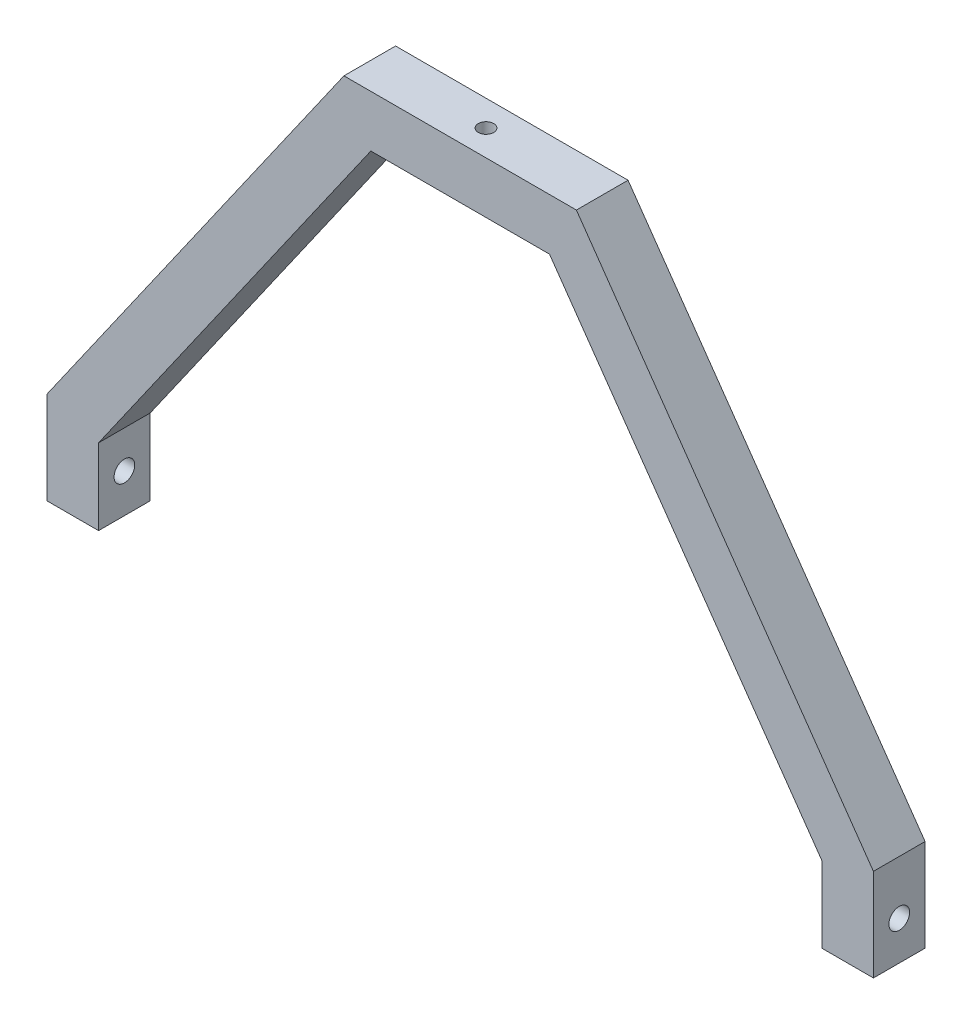
ISO-10303-21;
HEADER;
FILE_DESCRIPTION(('STEP AP214'),'2;1');
FILE_NAME('part.step','',(''),(''),'','','');
FILE_SCHEMA(('AUTOMOTIVE_DESIGN { 1 0 10303 214 1 1 1 1 }'));
ENDSEC;
DATA;
#1=APPLICATION_CONTEXT('core data for automotive mechanical design processes');
#2=APPLICATION_PROTOCOL_DEFINITION('international standard','automotive_design',2000,#1);
#3=PRODUCT_CONTEXT('',#1,'mechanical');
#4=PRODUCT('Part','Part','',(#3));
#5=PRODUCT_RELATED_PRODUCT_CATEGORY('part','',(#4));
#6=PRODUCT_DEFINITION_FORMATION('','',#4);
#7=PRODUCT_DEFINITION_CONTEXT('part definition',#1,'design');
#8=PRODUCT_DEFINITION('design','',#6,#7);
#9=PRODUCT_DEFINITION_SHAPE('','',#8);
#10=(LENGTH_UNIT() NAMED_UNIT(*) SI_UNIT(.MILLI.,.METRE.));
#11=(NAMED_UNIT(*) PLANE_ANGLE_UNIT() SI_UNIT($,.RADIAN.));
#12=(NAMED_UNIT(*) SI_UNIT($,.STERADIAN.) SOLID_ANGLE_UNIT());
#13=UNCERTAINTY_MEASURE_WITH_UNIT(LENGTH_MEASURE(1.E-05),#10,'distance_accuracy_value','');
#14=(GEOMETRIC_REPRESENTATION_CONTEXT(3) GLOBAL_UNCERTAINTY_ASSIGNED_CONTEXT((#13)) GLOBAL_UNIT_ASSIGNED_CONTEXT((#10,
#11,#12)) REPRESENTATION_CONTEXT('',''));
#15=CARTESIAN_POINT('',(0.,0.,0.));
#16=DIRECTION('',(0.,0.,1.));
#17=DIRECTION('',(1.,0.,0.));
#18=AXIS2_PLACEMENT_3D('',#15,#16,#17);
#19=CARTESIAN_POINT('',(-34.5886589889651,-10.,20.));
#20=DIRECTION('',(-0.819152044288991,0.573576436351047,0.));
#21=DIRECTION('',(-0.573576436351047,-0.819152044288991,0.));
#22=AXIS2_PLACEMENT_3D('',#19,#20,#21);
#23=PLANE('',#22);
#24=DIRECTION('',(0.573576436351047,0.819152044288991,0.));
#25=VECTOR('',#24,1.);
#26=CARTESIAN_POINT('',(-34.5886589889651,-10.,0.));
#27=LINE('',#26,#25);
#28=CARTESIAN_POINT('',(-140.,-160.542996552923,0.));
#29=VERTEX_POINT('',#28);
#30=CARTESIAN_POINT('',(-34.5886589889651,-10.,0.));
#31=VERTEX_POINT('',#30);
#32=EDGE_CURVE('E153',#29,#31,#27,.T.);
#33=ORIENTED_EDGE('',*,*,#32,.T.);
#34=DIRECTION('',(0.,0.,-1.));
#35=VECTOR('',#34,1.);
#36=CARTESIAN_POINT('',(-34.5886589889651,-10.,20.));
#37=LINE('',#36,#35);
#38=CARTESIAN_POINT('',(-34.5886589889651,-10.,20.));
#39=VERTEX_POINT('',#38);
#40=EDGE_CURVE('E11',#39,#31,#37,.T.);
#41=ORIENTED_EDGE('',*,*,#40,.F.);
#42=DIRECTION('',(0.573576436351047,0.819152044288991,0.));
#43=VECTOR('',#42,1.);
#44=CARTESIAN_POINT('',(-34.5886589889651,-10.,20.));
#45=LINE('',#44,#43);
#46=CARTESIAN_POINT('',(-140.,-160.542996552923,20.));
#47=VERTEX_POINT('',#46);
#48=EDGE_CURVE('E177',#47,#39,#45,.T.);
#49=ORIENTED_EDGE('',*,*,#48,.F.);
#50=DIRECTION('',(0.,0.,-1.));
#51=VECTOR('',#50,1.);
#52=CARTESIAN_POINT('',(-140.,-160.542996552923,20.));
#53=LINE('',#52,#51);
#54=EDGE_CURVE('E149',#47,#29,#53,.T.);
#55=ORIENTED_EDGE('',*,*,#54,.T.);
#56=EDGE_LOOP('',(#33,#41,#49,#55));
#57=FACE_BOUND('',#56,.T.);
#58=ADVANCED_FACE('F32',(#57),#23,.F.);
#59=CARTESIAN_POINT('',(0.,-10.,20.));
#60=DIRECTION('',(0.,1.,0.));
#61=DIRECTION('',(0.,0.,1.));
#62=AXIS2_PLACEMENT_3D('',#59,#60,#61);
#63=PLANE('',#62);
#64=CARTESIAN_POINT('',(0.,-10.,10.));
#65=DIRECTION('',(0.,1.,0.));
#66=DIRECTION('',(0.,0.,1.));
#67=AXIS2_PLACEMENT_3D('',#64,#65,#66);
#68=CIRCLE('',#67,3.);
#69=CARTESIAN_POINT('',(0.,-10.,13.));
#70=VERTEX_POINT('',#69);
#71=EDGE_CURVE('E297',#70,#70,#68,.F.);
#72=ORIENTED_EDGE('',*,*,#71,.F.);
#73=EDGE_LOOP('',(#72));
#74=FACE_BOUND('',#73,.T.);
#75=DIRECTION('',(1.,0.,0.));
#76=VECTOR('',#75,1.);
#77=CARTESIAN_POINT('',(0.,-10.,0.));
#78=LINE('',#77,#76);
#79=CARTESIAN_POINT('',(34.5886589889651,-10.,0.));
#80=VERTEX_POINT('',#79);
#81=EDGE_CURVE('E156',#31,#80,#78,.T.);
#82=ORIENTED_EDGE('',*,*,#81,.T.);
#83=DIRECTION('',(0.,0.,-1.));
#84=VECTOR('',#83,1.);
#85=CARTESIAN_POINT('',(34.5886589889651,-10.,20.));
#86=LINE('',#85,#84);
#87=CARTESIAN_POINT('',(34.5886589889651,-10.,20.));
#88=VERTEX_POINT('',#87);
#89=EDGE_CURVE('E41',#88,#80,#86,.T.);
#90=ORIENTED_EDGE('',*,*,#89,.F.);
#91=DIRECTION('',(1.,0.,0.));
#92=VECTOR('',#91,1.);
#93=CARTESIAN_POINT('',(0.,-10.,20.));
#94=LINE('',#93,#92);
#95=EDGE_CURVE('E104',#39,#88,#94,.T.);
#96=ORIENTED_EDGE('',*,*,#95,.F.);
#97=ORIENTED_EDGE('',*,*,#40,.T.);
#98=EDGE_LOOP('',(#82,#90,#96,#97));
#99=FACE_BOUND('',#98,.T.);
#100=ADVANCED_FACE('F257',(#74,#99),#63,.F.);
#101=CARTESIAN_POINT('',(34.5886589889651,-10.,20.));
#102=DIRECTION('',(0.819152044288991,0.573576436351047,0.));
#103=DIRECTION('',(-0.573576436351047,0.819152044288991,0.));
#104=AXIS2_PLACEMENT_3D('',#101,#102,#103);
#105=PLANE('',#104);
#106=DIRECTION('',(0.573576436351047,-0.819152044288991,0.));
#107=VECTOR('',#106,1.);
#108=CARTESIAN_POINT('',(34.5886589889651,-10.,0.));
#109=LINE('',#108,#107);
#110=CARTESIAN_POINT('',(140.,-160.542996552923,0.));
#111=VERTEX_POINT('',#110);
#112=EDGE_CURVE('E159',#80,#111,#109,.T.);
#113=ORIENTED_EDGE('',*,*,#112,.T.);
#114=DIRECTION('',(0.,0.,-1.));
#115=VECTOR('',#114,1.);
#116=CARTESIAN_POINT('',(140.,-160.542996552923,20.));
#117=LINE('',#116,#115);
#118=CARTESIAN_POINT('',(140.,-160.542996552923,20.));
#119=VERTEX_POINT('',#118);
#120=EDGE_CURVE('E196',#119,#111,#117,.T.);
#121=ORIENTED_EDGE('',*,*,#120,.F.);
#122=DIRECTION('',(0.573576436351047,-0.819152044288991,0.));
#123=VECTOR('',#122,1.);
#124=CARTESIAN_POINT('',(34.5886589889651,-10.,20.));
#125=LINE('',#124,#123);
#126=EDGE_CURVE('E205',#88,#119,#125,.T.);
#127=ORIENTED_EDGE('',*,*,#126,.F.);
#128=ORIENTED_EDGE('',*,*,#89,.T.);
#129=EDGE_LOOP('',(#113,#121,#127,#128));
#130=FACE_BOUND('',#129,.T.);
#131=ADVANCED_FACE('F203',(#130),#105,.F.);
#132=CARTESIAN_POINT('',(140.,-160.542996552923,20.));
#133=DIRECTION('',(1.,0.,0.));
#134=DIRECTION('',(0.,0.,-1.));
#135=AXIS2_PLACEMENT_3D('',#132,#133,#134);
#136=PLANE('',#135);
#137=CARTESIAN_POINT('',(140.,-175.,10.));
#138=DIRECTION('',(1.,0.,0.));
#139=DIRECTION('',(0.,0.,-1.));
#140=AXIS2_PLACEMENT_3D('',#137,#138,#139);
#141=CIRCLE('',#140,4.);
#142=CARTESIAN_POINT('',(140.,-175.,6.));
#143=VERTEX_POINT('',#142);
#144=EDGE_CURVE('E157',#143,#143,#141,.T.);
#145=ORIENTED_EDGE('',*,*,#144,.T.);
#146=EDGE_LOOP('',(#145));
#147=FACE_BOUND('',#146,.T.);
#148=DIRECTION('',(0.,-1.,0.));
#149=VECTOR('',#148,1.);
#150=CARTESIAN_POINT('',(140.,-160.542996552923,0.));
#151=LINE('',#150,#149);
#152=CARTESIAN_POINT('',(140.,-190.,0.));
#153=VERTEX_POINT('',#152);
#154=EDGE_CURVE('E161',#111,#153,#151,.T.);
#155=ORIENTED_EDGE('',*,*,#154,.T.);
#156=DIRECTION('',(0.,0.,-1.));
#157=VECTOR('',#156,1.);
#158=CARTESIAN_POINT('',(140.,-190.,20.));
#159=LINE('',#158,#157);
#160=CARTESIAN_POINT('',(140.,-190.,20.));
#161=VERTEX_POINT('',#160);
#162=EDGE_CURVE('E193',#161,#153,#159,.T.);
#163=ORIENTED_EDGE('',*,*,#162,.F.);
#164=DIRECTION('',(0.,-1.,0.));
#165=VECTOR('',#164,1.);
#166=CARTESIAN_POINT('',(140.,-160.542996552923,20.));
#167=LINE('',#166,#165);
#168=EDGE_CURVE('E223',#119,#161,#167,.T.);
#169=ORIENTED_EDGE('',*,*,#168,.F.);
#170=ORIENTED_EDGE('',*,*,#120,.T.);
#171=EDGE_LOOP('',(#155,#163,#169,#170));
#172=FACE_BOUND('',#171,.T.);
#173=ADVANCED_FACE('F214',(#147,#172),#136,.F.);
#174=CARTESIAN_POINT('',(140.,-190.,20.));
#175=DIRECTION('',(0.,1.,0.));
#176=DIRECTION('',(0.,0.,1.));
#177=AXIS2_PLACEMENT_3D('',#174,#175,#176);
#178=PLANE('',#177);
#179=DIRECTION('',(1.,0.,0.));
#180=VECTOR('',#179,1.);
#181=CARTESIAN_POINT('',(140.,-190.,0.));
#182=LINE('',#181,#180);
#183=CARTESIAN_POINT('',(160.,-190.,0.));
#184=VERTEX_POINT('',#183);
#185=EDGE_CURVE('E163',#153,#184,#182,.T.);
#186=ORIENTED_EDGE('',*,*,#185,.T.);
#187=DIRECTION('',(0.,0.,-1.));
#188=VECTOR('',#187,1.);
#189=CARTESIAN_POINT('',(160.,-190.,20.));
#190=LINE('',#189,#188);
#191=CARTESIAN_POINT('',(160.,-190.,20.));
#192=VERTEX_POINT('',#191);
#193=EDGE_CURVE('E190',#192,#184,#190,.T.);
#194=ORIENTED_EDGE('',*,*,#193,.F.);
#195=DIRECTION('',(1.,0.,0.));
#196=VECTOR('',#195,1.);
#197=CARTESIAN_POINT('',(140.,-190.,20.));
#198=LINE('',#197,#196);
#199=EDGE_CURVE('E220',#161,#192,#198,.T.);
#200=ORIENTED_EDGE('',*,*,#199,.F.);
#201=ORIENTED_EDGE('',*,*,#162,.T.);
#202=EDGE_LOOP('',(#186,#194,#200,#201));
#203=FACE_BOUND('',#202,.T.);
#204=ADVANCED_FACE('F218',(#203),#178,.F.);
#205=CARTESIAN_POINT('',(160.,-154.237020775343,20.));
#206=DIRECTION('',(-1.,0.,0.));
#207=DIRECTION('',(0.,0.,1.));
#208=AXIS2_PLACEMENT_3D('',#205,#206,#207);
#209=PLANE('',#208);
#210=CARTESIAN_POINT('',(160.,-175.,10.));
#211=DIRECTION('',(1.,0.,0.));
#212=DIRECTION('',(0.,0.,-1.));
#213=AXIS2_PLACEMENT_3D('',#210,#211,#212);
#214=CIRCLE('',#213,4.);
#215=CARTESIAN_POINT('',(160.,-175.,6.));
#216=VERTEX_POINT('',#215);
#217=EDGE_CURVE('E294',#216,#216,#214,.T.);
#218=ORIENTED_EDGE('',*,*,#217,.F.);
#219=EDGE_LOOP('',(#218));
#220=FACE_BOUND('',#219,.T.);
#221=DIRECTION('',(0.,1.,0.));
#222=VECTOR('',#221,1.);
#223=CARTESIAN_POINT('',(160.,-154.237020775343,0.));
#224=LINE('',#223,#222);
#225=CARTESIAN_POINT('',(160.,-154.237020775343,0.));
#226=VERTEX_POINT('',#225);
#227=EDGE_CURVE('E165',#184,#226,#224,.T.);
#228=ORIENTED_EDGE('',*,*,#227,.T.);
#229=DIRECTION('',(0.,0.,-1.));
#230=VECTOR('',#229,1.);
#231=CARTESIAN_POINT('',(160.,-154.237020775343,20.));
#232=LINE('',#231,#230);
#233=CARTESIAN_POINT('',(160.,-154.237020775343,20.));
#234=VERTEX_POINT('',#233);
#235=EDGE_CURVE('E187',#234,#226,#232,.T.);
#236=ORIENTED_EDGE('',*,*,#235,.F.);
#237=DIRECTION('',(0.,1.,0.));
#238=VECTOR('',#237,1.);
#239=CARTESIAN_POINT('',(160.,-154.237020775343,20.));
#240=LINE('',#239,#238);
#241=EDGE_CURVE('E222',#192,#234,#240,.T.);
#242=ORIENTED_EDGE('',*,*,#241,.F.);
#243=ORIENTED_EDGE('',*,*,#193,.T.);
#244=EDGE_LOOP('',(#228,#236,#242,#243));
#245=FACE_BOUND('',#244,.T.);
#246=ADVANCED_FACE('F273',(#220,#245),#209,.F.);
#247=CARTESIAN_POINT('',(45.,10.,20.));
#248=DIRECTION('',(-0.819152044288991,-0.573576436351047,0.));
#249=DIRECTION('',(0.573576436351047,-0.819152044288991,0.));
#250=AXIS2_PLACEMENT_3D('',#247,#248,#249);
#251=PLANE('',#250);
#252=DIRECTION('',(-0.573576436351047,0.819152044288991,0.));
#253=VECTOR('',#252,1.);
#254=CARTESIAN_POINT('',(45.,10.,0.));
#255=LINE('',#254,#253);
#256=CARTESIAN_POINT('',(45.,10.,0.));
#257=VERTEX_POINT('',#256);
#258=EDGE_CURVE('E167',#226,#257,#255,.T.);
#259=ORIENTED_EDGE('',*,*,#258,.T.);
#260=DIRECTION('',(0.,0.,-1.));
#261=VECTOR('',#260,1.);
#262=CARTESIAN_POINT('',(45.,10.,20.));
#263=LINE('',#262,#261);
#264=CARTESIAN_POINT('',(45.,10.,20.));
#265=VERTEX_POINT('',#264);
#266=EDGE_CURVE('E184',#265,#257,#263,.T.);
#267=ORIENTED_EDGE('',*,*,#266,.F.);
#268=DIRECTION('',(-0.573576436351047,0.819152044288991,0.));
#269=VECTOR('',#268,1.);
#270=CARTESIAN_POINT('',(45.,10.,20.));
#271=LINE('',#270,#269);
#272=EDGE_CURVE('E225',#234,#265,#271,.T.);
#273=ORIENTED_EDGE('',*,*,#272,.F.);
#274=ORIENTED_EDGE('',*,*,#235,.T.);
#275=EDGE_LOOP('',(#259,#267,#273,#274));
#276=FACE_BOUND('',#275,.T.);
#277=ADVANCED_FACE('F276',(#276),#251,.F.);
#278=CARTESIAN_POINT('',(0.,10.,20.));
#279=DIRECTION('',(0.,-1.,0.));
#280=DIRECTION('',(1.,0.,0.));
#281=AXIS2_PLACEMENT_3D('',#278,#279,#280);
#282=PLANE('',#281);
#283=CARTESIAN_POINT('',(0.,10.,10.));
#284=DIRECTION('',(0.,1.,0.));
#285=DIRECTION('',(-1.,0.,0.));
#286=AXIS2_PLACEMENT_3D('',#283,#284,#285);
#287=CIRCLE('',#286,3.);
#288=CARTESIAN_POINT('',(-3.,10.,10.));
#289=VERTEX_POINT('',#288);
#290=EDGE_CURVE('E427',#289,#289,#287,.T.);
#291=ORIENTED_EDGE('',*,*,#290,.F.);
#292=EDGE_LOOP('',(#291));
#293=FACE_BOUND('',#292,.T.);
#294=DIRECTION('',(-1.,0.,0.));
#295=VECTOR('',#294,1.);
#296=CARTESIAN_POINT('',(0.,10.,0.));
#297=LINE('',#296,#295);
#298=CARTESIAN_POINT('',(-45.,9.99999999999999,0.));
#299=VERTEX_POINT('',#298);
#300=EDGE_CURVE('E170',#257,#299,#297,.T.);
#301=ORIENTED_EDGE('',*,*,#300,.T.);
#302=DIRECTION('',(0.,0.,-1.));
#303=VECTOR('',#302,1.);
#304=CARTESIAN_POINT('',(-45.,9.99999999999999,20.));
#305=LINE('',#304,#303);
#306=CARTESIAN_POINT('',(-45.,9.99999999999999,20.));
#307=VERTEX_POINT('',#306);
#308=EDGE_CURVE('E181',#307,#299,#305,.T.);
#309=ORIENTED_EDGE('',*,*,#308,.F.);
#310=DIRECTION('',(-1.,0.,0.));
#311=VECTOR('',#310,1.);
#312=CARTESIAN_POINT('',(0.,10.,20.));
#313=LINE('',#312,#311);
#314=EDGE_CURVE('E231',#265,#307,#313,.T.);
#315=ORIENTED_EDGE('',*,*,#314,.F.);
#316=ORIENTED_EDGE('',*,*,#266,.T.);
#317=EDGE_LOOP('',(#301,#309,#315,#316));
#318=FACE_BOUND('',#317,.T.);
#319=ADVANCED_FACE('F237',(#293,#318),#282,.F.);
#320=CARTESIAN_POINT('',(-45.,9.99999999999999,20.));
#321=DIRECTION('',(0.819152044288991,-0.573576436351047,0.));
#322=DIRECTION('',(0.573576436351047,0.819152044288991,0.));
#323=AXIS2_PLACEMENT_3D('',#320,#321,#322);
#324=PLANE('',#323);
#325=DIRECTION('',(-0.573576436351047,-0.819152044288991,0.));
#326=VECTOR('',#325,1.);
#327=CARTESIAN_POINT('',(-45.,9.99999999999999,0.));
#328=LINE('',#327,#326);
#329=CARTESIAN_POINT('',(-160.,-154.237020775343,0.));
#330=VERTEX_POINT('',#329);
#331=EDGE_CURVE('E172',#299,#330,#328,.T.);
#332=ORIENTED_EDGE('',*,*,#331,.T.);
#333=DIRECTION('',(0.,0.,-1.));
#334=VECTOR('',#333,1.);
#335=CARTESIAN_POINT('',(-160.,-154.237020775343,20.));
#336=LINE('',#335,#334);
#337=CARTESIAN_POINT('',(-160.,-154.237020775343,20.));
#338=VERTEX_POINT('',#337);
#339=EDGE_CURVE('E144',#338,#330,#336,.T.);
#340=ORIENTED_EDGE('',*,*,#339,.F.);
#341=DIRECTION('',(-0.573576436351047,-0.819152044288991,0.));
#342=VECTOR('',#341,1.);
#343=CARTESIAN_POINT('',(-45.,9.99999999999999,20.));
#344=LINE('',#343,#342);
#345=EDGE_CURVE('E135',#307,#338,#344,.T.);
#346=ORIENTED_EDGE('',*,*,#345,.F.);
#347=ORIENTED_EDGE('',*,*,#308,.T.);
#348=EDGE_LOOP('',(#332,#340,#346,#347));
#349=FACE_BOUND('',#348,.T.);
#350=ADVANCED_FACE('F240',(#349),#324,.F.);
#351=CARTESIAN_POINT('',(-160.,-154.237020775343,20.));
#352=DIRECTION('',(1.,0.,0.));
#353=DIRECTION('',(0.,1.,0.));
#354=AXIS2_PLACEMENT_3D('',#351,#352,#353);
#355=PLANE('',#354);
#356=CARTESIAN_POINT('',(-160.,-175.,10.));
#357=DIRECTION('',(1.,0.,0.));
#358=DIRECTION('',(0.,1.,0.));
#359=AXIS2_PLACEMENT_3D('',#356,#357,#358);
#360=CIRCLE('',#359,4.);
#361=CARTESIAN_POINT('',(-160.,-171.,10.));
#362=VERTEX_POINT('',#361);
#363=EDGE_CURVE('E292',#362,#362,#360,.F.);
#364=ORIENTED_EDGE('',*,*,#363,.F.);
#365=EDGE_LOOP('',(#364));
#366=FACE_BOUND('',#365,.T.);
#367=DIRECTION('',(0.,-1.,0.));
#368=VECTOR('',#367,1.);
#369=CARTESIAN_POINT('',(-160.,-154.237020775343,0.));
#370=LINE('',#369,#368);
#371=CARTESIAN_POINT('',(-160.,-190.,0.));
#372=VERTEX_POINT('',#371);
#373=EDGE_CURVE('E143',#330,#372,#370,.T.);
#374=ORIENTED_EDGE('',*,*,#373,.T.);
#375=DIRECTION('',(0.,0.,-1.));
#376=VECTOR('',#375,1.);
#377=CARTESIAN_POINT('',(-160.,-190.,20.));
#378=LINE('',#377,#376);
#379=CARTESIAN_POINT('',(-160.,-190.,20.));
#380=VERTEX_POINT('',#379);
#381=EDGE_CURVE('E140',#380,#372,#378,.T.);
#382=ORIENTED_EDGE('',*,*,#381,.F.);
#383=DIRECTION('',(0.,-1.,0.));
#384=VECTOR('',#383,1.);
#385=CARTESIAN_POINT('',(-160.,-154.237020775343,20.));
#386=LINE('',#385,#384);
#387=EDGE_CURVE('E129',#338,#380,#386,.T.);
#388=ORIENTED_EDGE('',*,*,#387,.F.);
#389=ORIENTED_EDGE('',*,*,#339,.T.);
#390=EDGE_LOOP('',(#374,#382,#388,#389));
#391=FACE_BOUND('',#390,.T.);
#392=ADVANCED_FACE('F141',(#366,#391),#355,.F.);
#393=CARTESIAN_POINT('',(-140.,-190.,20.));
#394=DIRECTION('',(0.,1.,0.));
#395=DIRECTION('',(0.,0.,1.));
#396=AXIS2_PLACEMENT_3D('',#393,#394,#395);
#397=PLANE('',#396);
#398=DIRECTION('',(1.,0.,0.));
#399=VECTOR('',#398,1.);
#400=CARTESIAN_POINT('',(-140.,-190.,0.));
#401=LINE('',#400,#399);
#402=CARTESIAN_POINT('',(-140.,-190.,0.));
#403=VERTEX_POINT('',#402);
#404=EDGE_CURVE('E90',#372,#403,#401,.T.);
#405=ORIENTED_EDGE('',*,*,#404,.T.);
#406=DIRECTION('',(0.,0.,-1.));
#407=VECTOR('',#406,1.);
#408=CARTESIAN_POINT('',(-140.,-190.,20.));
#409=LINE('',#408,#407);
#410=CARTESIAN_POINT('',(-140.,-190.,20.));
#411=VERTEX_POINT('',#410);
#412=EDGE_CURVE('E145',#411,#403,#409,.T.);
#413=ORIENTED_EDGE('',*,*,#412,.F.);
#414=DIRECTION('',(1.,0.,0.));
#415=VECTOR('',#414,1.);
#416=CARTESIAN_POINT('',(-140.,-190.,20.));
#417=LINE('',#416,#415);
#418=EDGE_CURVE('E133',#380,#411,#417,.T.);
#419=ORIENTED_EDGE('',*,*,#418,.F.);
#420=ORIENTED_EDGE('',*,*,#381,.T.);
#421=EDGE_LOOP('',(#405,#413,#419,#420));
#422=FACE_BOUND('',#421,.T.);
#423=ADVANCED_FACE('F147',(#422),#397,.F.);
#424=CARTESIAN_POINT('',(-140.,-160.542996552923,20.));
#425=DIRECTION('',(-1.,0.,0.));
#426=DIRECTION('',(0.,0.,1.));
#427=AXIS2_PLACEMENT_3D('',#424,#425,#426);
#428=PLANE('',#427);
#429=CARTESIAN_POINT('',(-140.,-175.,10.));
#430=DIRECTION('',(-1.,0.,0.));
#431=DIRECTION('',(0.,0.,1.));
#432=AXIS2_PLACEMENT_3D('',#429,#430,#431);
#433=CIRCLE('',#432,4.);
#434=CARTESIAN_POINT('',(-140.,-175.,14.));
#435=VERTEX_POINT('',#434);
#436=EDGE_CURVE('E35',#435,#435,#433,.T.);
#437=ORIENTED_EDGE('',*,*,#436,.T.);
#438=EDGE_LOOP('',(#437));
#439=FACE_BOUND('',#438,.T.);
#440=DIRECTION('',(0.,1.,0.));
#441=VECTOR('',#440,1.);
#442=CARTESIAN_POINT('',(-140.,-160.542996552923,0.));
#443=LINE('',#442,#441);
#444=EDGE_CURVE('E96',#403,#29,#443,.T.);
#445=ORIENTED_EDGE('',*,*,#444,.T.);
#446=ORIENTED_EDGE('',*,*,#54,.F.);
#447=DIRECTION('',(0.,1.,0.));
#448=VECTOR('',#447,1.);
#449=CARTESIAN_POINT('',(-140.,-160.542996552923,20.));
#450=LINE('',#449,#448);
#451=EDGE_CURVE('E49',#411,#47,#450,.T.);
#452=ORIENTED_EDGE('',*,*,#451,.F.);
#453=ORIENTED_EDGE('',*,*,#412,.T.);
#454=EDGE_LOOP('',(#445,#446,#452,#453));
#455=FACE_BOUND('',#454,.T.);
#456=ADVANCED_FACE('F244',(#439,#455),#428,.F.);
#457=CARTESIAN_POINT('',(0.,0.,20.));
#458=DIRECTION('',(0.,0.,1.));
#459=DIRECTION('',(1.,0.,0.));
#460=AXIS2_PLACEMENT_3D('',#457,#458,#459);
#461=PLANE('',#460);
#462=ORIENTED_EDGE('',*,*,#48,.T.);
#463=ORIENTED_EDGE('',*,*,#95,.T.);
#464=ORIENTED_EDGE('',*,*,#126,.T.);
#465=ORIENTED_EDGE('',*,*,#168,.T.);
#466=ORIENTED_EDGE('',*,*,#199,.T.);
#467=ORIENTED_EDGE('',*,*,#241,.T.);
#468=ORIENTED_EDGE('',*,*,#272,.T.);
#469=ORIENTED_EDGE('',*,*,#314,.T.);
#470=ORIENTED_EDGE('',*,*,#345,.T.);
#471=ORIENTED_EDGE('',*,*,#387,.T.);
#472=ORIENTED_EDGE('',*,*,#418,.T.);
#473=ORIENTED_EDGE('',*,*,#451,.T.);
#474=EDGE_LOOP('',(#462,#463,#464,#465,#466,#467,#468,#469,#470,#471,#472,#473));
#475=FACE_BOUND('',#474,.T.);
#476=ADVANCED_FACE('F131',(#475),#461,.T.);
#477=CARTESIAN_POINT('',(0.,0.,0.));
#478=DIRECTION('',(0.,0.,1.));
#479=DIRECTION('',(1.,0.,0.));
#480=AXIS2_PLACEMENT_3D('',#477,#478,#479);
#481=PLANE('',#480);
#482=ORIENTED_EDGE('',*,*,#32,.F.);
#483=ORIENTED_EDGE('',*,*,#444,.F.);
#484=ORIENTED_EDGE('',*,*,#404,.F.);
#485=ORIENTED_EDGE('',*,*,#373,.F.);
#486=ORIENTED_EDGE('',*,*,#331,.F.);
#487=ORIENTED_EDGE('',*,*,#300,.F.);
#488=ORIENTED_EDGE('',*,*,#258,.F.);
#489=ORIENTED_EDGE('',*,*,#227,.F.);
#490=ORIENTED_EDGE('',*,*,#185,.F.);
#491=ORIENTED_EDGE('',*,*,#154,.F.);
#492=ORIENTED_EDGE('',*,*,#112,.F.);
#493=ORIENTED_EDGE('',*,*,#81,.F.);
#494=EDGE_LOOP('',(#482,#483,#484,#485,#486,#487,#488,#489,#490,#491,#492,#493));
#495=FACE_BOUND('',#494,.T.);
#496=ADVANCED_FACE('F209',(#495),#481,.F.);
#497=CARTESIAN_POINT('',(-171.313708498985,-175.,10.));
#498=DIRECTION('',(1.,0.,0.));
#499=DIRECTION('',(0.,0.,-1.));
#500=AXIS2_PLACEMENT_3D('',#497,#498,#499);
#501=CYLINDRICAL_SURFACE('',#500,4.);
#502=ORIENTED_EDGE('',*,*,#363,.T.);
#503=EDGE_LOOP('',(#502));
#504=FACE_BOUND('',#503,.T.);
#505=ORIENTED_EDGE('',*,*,#436,.F.);
#506=EDGE_LOOP('',(#505));
#507=FACE_BOUND('',#506,.T.);
#508=ADVANCED_FACE('F309',(#504,#507),#501,.F.);
#509=ORIENTED_EDGE('',*,*,#217,.T.);
#510=EDGE_LOOP('',(#509));
#511=FACE_BOUND('',#510,.T.);
#512=ORIENTED_EDGE('',*,*,#144,.F.);
#513=EDGE_LOOP('',(#512));
#514=FACE_BOUND('',#513,.T.);
#515=ADVANCED_FACE('F306',(#511,#514),#501,.F.);
#516=CARTESIAN_POINT('',(0.,-18.4852813742386,10.));
#517=DIRECTION('',(0.,1.,0.));
#518=DIRECTION('',(-1.,0.,0.));
#519=AXIS2_PLACEMENT_3D('',#516,#517,#518);
#520=CYLINDRICAL_SURFACE('',#519,3.);
#521=ORIENTED_EDGE('',*,*,#71,.T.);
#522=EDGE_LOOP('',(#521));
#523=FACE_BOUND('',#522,.T.);
#524=ORIENTED_EDGE('',*,*,#290,.T.);
#525=EDGE_LOOP('',(#524));
#526=FACE_BOUND('',#525,.T.);
#527=ADVANCED_FACE('F308',(#523,#526),#520,.F.);
#528=CLOSED_SHELL('',(#58,#100,#131,#173,#204,#246,#277,#319,#350,#392,#423,#456,#476,#496,#508,
#515,#527));
#529=MANIFOLD_SOLID_BREP('B2',#528);
#530=ADVANCED_BREP_SHAPE_REPRESENTATION('',(#18,#529),#14);
#531=SHAPE_DEFINITION_REPRESENTATION(#9,#530);
ENDSEC;
END-ISO-10303-21;
